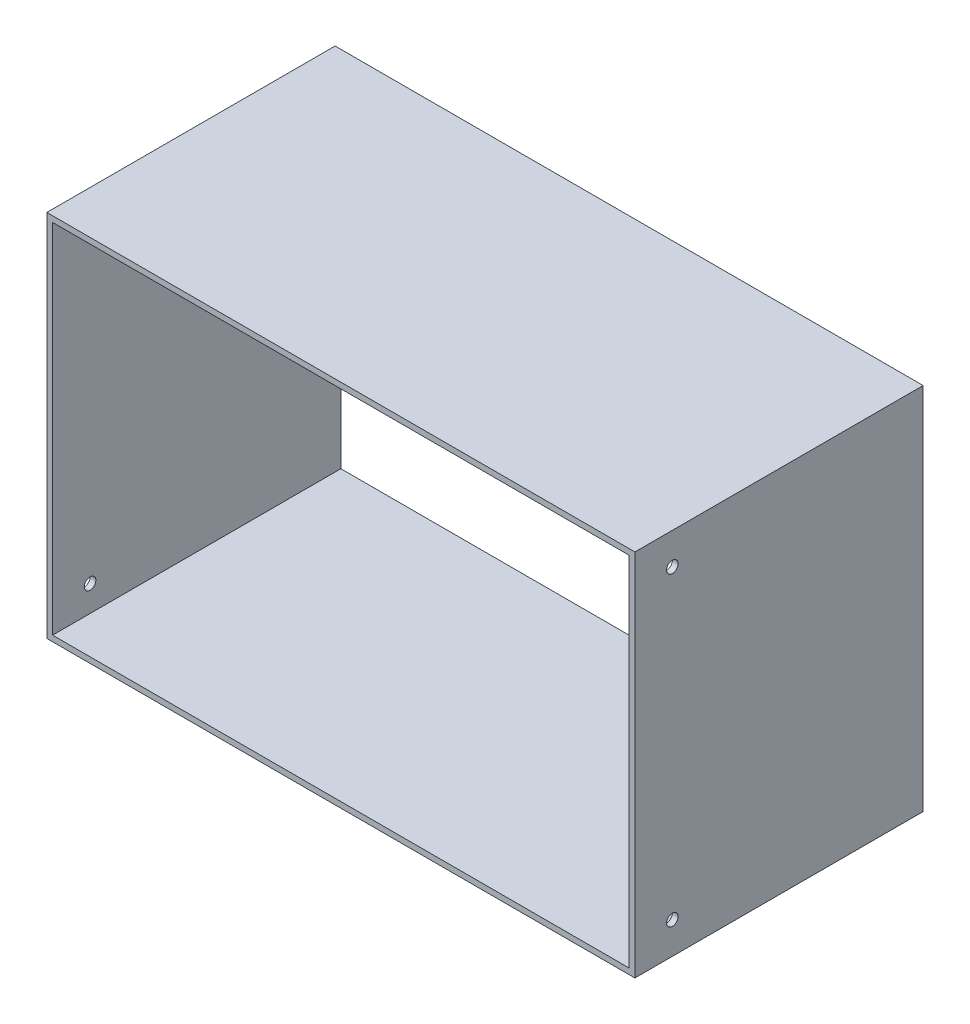
ISO-10303-21;
HEADER;
FILE_DESCRIPTION(('STEP AP214'),'2;1');
FILE_NAME('part.step','',(''),(''),'','','');
FILE_SCHEMA(('AUTOMOTIVE_DESIGN { 1 0 10303 214 1 1 1 1 }'));
ENDSEC;
DATA;
#1=APPLICATION_CONTEXT('core data for automotive mechanical design processes');
#2=APPLICATION_PROTOCOL_DEFINITION('international standard','automotive_design',2000,#1);
#3=PRODUCT_CONTEXT('',#1,'mechanical');
#4=PRODUCT('Part','Part','',(#3));
#5=PRODUCT_RELATED_PRODUCT_CATEGORY('part','',(#4));
#6=PRODUCT_DEFINITION_FORMATION('','',#4);
#7=PRODUCT_DEFINITION_CONTEXT('part definition',#1,'design');
#8=PRODUCT_DEFINITION('design','',#6,#7);
#9=PRODUCT_DEFINITION_SHAPE('','',#8);
#10=(LENGTH_UNIT() NAMED_UNIT(*) SI_UNIT(.MILLI.,.METRE.));
#11=(NAMED_UNIT(*) PLANE_ANGLE_UNIT() SI_UNIT($,.RADIAN.));
#12=(NAMED_UNIT(*) SI_UNIT($,.STERADIAN.) SOLID_ANGLE_UNIT());
#13=UNCERTAINTY_MEASURE_WITH_UNIT(LENGTH_MEASURE(1.E-05),#10,'distance_accuracy_value','');
#14=(GEOMETRIC_REPRESENTATION_CONTEXT(3) GLOBAL_UNCERTAINTY_ASSIGNED_CONTEXT((#13)) GLOBAL_UNIT_ASSIGNED_CONTEXT((#10,
#11,#12)) REPRESENTATION_CONTEXT('',''));
#15=CARTESIAN_POINT('',(0.,0.,0.));
#16=DIRECTION('',(0.,0.,1.));
#17=DIRECTION('',(1.,0.,0.));
#18=AXIS2_PLACEMENT_3D('',#15,#16,#17);
#19=CARTESIAN_POINT('',(0.,2.99999999999996,50.));
#20=DIRECTION('',(0.,-1.,0.));
#21=DIRECTION('',(1.,0.,0.));
#22=AXIS2_PLACEMENT_3D('',#19,#20,#21);
#23=PLANE('',#22);
#24=DIRECTION('',(-1.,0.,0.));
#25=VECTOR('',#24,1.);
#26=CARTESIAN_POINT('',(0.,2.99999999999996,0.));
#27=LINE('',#26,#25);
#28=CARTESIAN_POINT('',(103.,2.99999999999998,0.));
#29=VERTEX_POINT('',#28);
#30=CARTESIAN_POINT('',(3.,2.99999999999996,0.));
#31=VERTEX_POINT('',#30);
#32=EDGE_CURVE('E143',#29,#31,#27,.T.);
#33=ORIENTED_EDGE('',*,*,#32,.T.);
#34=DIRECTION('',(0.,0.,-1.));
#35=VECTOR('',#34,1.);
#36=CARTESIAN_POINT('',(3.,2.99999999999996,50.));
#37=LINE('',#36,#35);
#38=CARTESIAN_POINT('',(3.,2.99999999999996,50.));
#39=VERTEX_POINT('',#38);
#40=EDGE_CURVE('E11',#39,#31,#37,.T.);
#41=ORIENTED_EDGE('',*,*,#40,.F.);
#42=DIRECTION('',(-1.,0.,0.));
#43=VECTOR('',#42,1.);
#44=CARTESIAN_POINT('',(0.,2.99999999999996,50.));
#45=LINE('',#44,#43);
#46=CARTESIAN_POINT('',(103.,2.99999999999998,50.));
#47=VERTEX_POINT('',#46);
#48=EDGE_CURVE('E119',#47,#39,#45,.T.);
#49=ORIENTED_EDGE('',*,*,#48,.F.);
#50=DIRECTION('',(0.,0.,-1.));
#51=VECTOR('',#50,1.);
#52=CARTESIAN_POINT('',(103.,2.99999999999998,50.));
#53=LINE('',#52,#51);
#54=EDGE_CURVE('E150',#47,#29,#53,.T.);
#55=ORIENTED_EDGE('',*,*,#54,.T.);
#56=EDGE_LOOP('',(#33,#41,#49,#55));
#57=FACE_BOUND('',#56,.T.);
#58=ADVANCED_FACE('F37',(#57),#23,.F.);
#59=CARTESIAN_POINT('',(3.,0.,50.));
#60=DIRECTION('',(-1.,0.,0.));
#61=DIRECTION('',(0.,-1.,0.));
#62=AXIS2_PLACEMENT_3D('',#59,#60,#61);
#63=PLANE('',#62);
#64=CARTESIAN_POINT('',(3.,7.49999999999998,43.5));
#65=DIRECTION('',(-1.,0.,0.));
#66=DIRECTION('',(0.,-1.,0.));
#67=AXIS2_PLACEMENT_3D('',#64,#65,#66);
#68=CIRCLE('',#67,0.999999999999998);
#69=CARTESIAN_POINT('',(3.,6.49999999999998,43.5));
#70=VERTEX_POINT('',#69);
#71=EDGE_CURVE('E137',#70,#70,#68,.T.);
#72=ORIENTED_EDGE('',*,*,#71,.T.);
#73=EDGE_LOOP('',(#72));
#74=FACE_BOUND('',#73,.T.);
#75=CARTESIAN_POINT('',(3.,60.5,43.5));
#76=DIRECTION('',(-1.,0.,0.));
#77=DIRECTION('',(0.,-1.,0.));
#78=AXIS2_PLACEMENT_3D('',#75,#76,#77);
#79=CIRCLE('',#78,0.999999999999998);
#80=CARTESIAN_POINT('',(3.,59.5,43.5));
#81=VERTEX_POINT('',#80);
#82=EDGE_CURVE('E169',#81,#81,#79,.T.);
#83=ORIENTED_EDGE('',*,*,#82,.T.);
#84=EDGE_LOOP('',(#83));
#85=FACE_BOUND('',#84,.T.);
#86=DIRECTION('',(0.,1.,0.));
#87=VECTOR('',#86,1.);
#88=CARTESIAN_POINT('',(3.,0.,0.));
#89=LINE('',#88,#87);
#90=CARTESIAN_POINT('',(3.,64.9999999999999,0.));
#91=VERTEX_POINT('',#90);
#92=EDGE_CURVE('E124',#31,#91,#89,.T.);
#93=ORIENTED_EDGE('',*,*,#92,.T.);
#94=DIRECTION('',(0.,0.,-1.));
#95=VECTOR('',#94,1.);
#96=CARTESIAN_POINT('',(3.,64.9999999999999,50.));
#97=LINE('',#96,#95);
#98=CARTESIAN_POINT('',(3.,64.9999999999999,50.));
#99=VERTEX_POINT('',#98);
#100=EDGE_CURVE('E47',#99,#91,#97,.T.);
#101=ORIENTED_EDGE('',*,*,#100,.F.);
#102=DIRECTION('',(0.,1.,0.));
#103=VECTOR('',#102,1.);
#104=CARTESIAN_POINT('',(3.,0.,50.));
#105=LINE('',#104,#103);
#106=EDGE_CURVE('E113',#39,#99,#105,.T.);
#107=ORIENTED_EDGE('',*,*,#106,.F.);
#108=ORIENTED_EDGE('',*,*,#40,.T.);
#109=EDGE_LOOP('',(#93,#101,#107,#108));
#110=FACE_BOUND('',#109,.T.);
#111=ADVANCED_FACE('F123',(#74,#85,#110),#63,.F.);
#112=CARTESIAN_POINT('',(0.,64.9999999999999,50.));
#113=DIRECTION('',(0.,1.,0.));
#114=DIRECTION('',(0.,0.,1.));
#115=AXIS2_PLACEMENT_3D('',#112,#113,#114);
#116=PLANE('',#115);
#117=DIRECTION('',(1.,0.,0.));
#118=VECTOR('',#117,1.);
#119=CARTESIAN_POINT('',(0.,64.9999999999999,0.));
#120=LINE('',#119,#118);
#121=CARTESIAN_POINT('',(103.,64.9999999999999,0.));
#122=VERTEX_POINT('',#121);
#123=EDGE_CURVE('E85',#91,#122,#120,.T.);
#124=ORIENTED_EDGE('',*,*,#123,.T.);
#125=DIRECTION('',(0.,0.,-1.));
#126=VECTOR('',#125,1.);
#127=CARTESIAN_POINT('',(103.,64.9999999999999,50.));
#128=LINE('',#127,#126);
#129=CARTESIAN_POINT('',(103.,64.9999999999999,50.));
#130=VERTEX_POINT('',#129);
#131=EDGE_CURVE('E125',#130,#122,#128,.T.);
#132=ORIENTED_EDGE('',*,*,#131,.F.);
#133=DIRECTION('',(1.,0.,0.));
#134=VECTOR('',#133,1.);
#135=CARTESIAN_POINT('',(0.,64.9999999999999,50.));
#136=LINE('',#135,#134);
#137=EDGE_CURVE('E117',#99,#130,#136,.T.);
#138=ORIENTED_EDGE('',*,*,#137,.F.);
#139=ORIENTED_EDGE('',*,*,#100,.T.);
#140=EDGE_LOOP('',(#124,#132,#138,#139));
#141=FACE_BOUND('',#140,.T.);
#142=ADVANCED_FACE('F127',(#141),#116,.F.);
#143=CARTESIAN_POINT('',(104.,0.,50.));
#144=DIRECTION('',(-1.,0.,0.));
#145=DIRECTION('',(0.,0.,1.));
#146=AXIS2_PLACEMENT_3D('',#143,#144,#145);
#147=PLANE('',#146);
#148=CARTESIAN_POINT('',(104.,7.49999999999998,43.5));
#149=DIRECTION('',(-1.,0.,0.));
#150=DIRECTION('',(0.,0.,1.));
#151=AXIS2_PLACEMENT_3D('',#148,#149,#150);
#152=CIRCLE('',#151,0.999999999999998);
#153=CARTESIAN_POINT('',(104.,7.49999999999998,44.5));
#154=VERTEX_POINT('',#153);
#155=EDGE_CURVE('E165',#154,#154,#152,.T.);
#156=ORIENTED_EDGE('',*,*,#155,.T.);
#157=EDGE_LOOP('',(#156));
#158=FACE_BOUND('',#157,.T.);
#159=CARTESIAN_POINT('',(104.,60.5,43.5));
#160=DIRECTION('',(-1.,0.,0.));
#161=DIRECTION('',(0.,0.,1.));
#162=AXIS2_PLACEMENT_3D('',#159,#160,#161);
#163=CIRCLE('',#162,0.999999999999998);
#164=CARTESIAN_POINT('',(104.,60.5,44.5));
#165=VERTEX_POINT('',#164);
#166=EDGE_CURVE('E172',#165,#165,#163,.T.);
#167=ORIENTED_EDGE('',*,*,#166,.T.);
#168=EDGE_LOOP('',(#167));
#169=FACE_BOUND('',#168,.T.);
#170=DIRECTION('',(0.,1.,0.));
#171=VECTOR('',#170,1.);
#172=CARTESIAN_POINT('',(104.,0.,0.));
#173=LINE('',#172,#171);
#174=CARTESIAN_POINT('',(104.,2.,0.));
#175=VERTEX_POINT('',#174);
#176=CARTESIAN_POINT('',(104.,66.,0.));
#177=VERTEX_POINT('',#176);
#178=EDGE_CURVE('E133',#175,#177,#173,.T.);
#179=ORIENTED_EDGE('',*,*,#178,.T.);
#180=DIRECTION('',(0.,0.,-1.));
#181=VECTOR('',#180,1.);
#182=CARTESIAN_POINT('',(104.,66.,50.));
#183=LINE('',#182,#181);
#184=CARTESIAN_POINT('',(104.,66.,50.));
#185=VERTEX_POINT('',#184);
#186=EDGE_CURVE('E152',#185,#177,#183,.T.);
#187=ORIENTED_EDGE('',*,*,#186,.F.);
#188=DIRECTION('',(0.,1.,0.));
#189=VECTOR('',#188,1.);
#190=CARTESIAN_POINT('',(104.,0.,50.));
#191=LINE('',#190,#189);
#192=CARTESIAN_POINT('',(104.,2.,50.));
#193=VERTEX_POINT('',#192);
#194=EDGE_CURVE('E149',#193,#185,#191,.T.);
#195=ORIENTED_EDGE('',*,*,#194,.F.);
#196=DIRECTION('',(0.,0.,-1.));
#197=VECTOR('',#196,1.);
#198=CARTESIAN_POINT('',(104.,2.,50.));
#199=LINE('',#198,#197);
#200=EDGE_CURVE('E129',#193,#175,#199,.T.);
#201=ORIENTED_EDGE('',*,*,#200,.T.);
#202=EDGE_LOOP('',(#179,#187,#195,#201));
#203=FACE_BOUND('',#202,.T.);
#204=ADVANCED_FACE('F39',(#158,#169,#203),#147,.F.);
#205=CARTESIAN_POINT('',(0.,66.,50.));
#206=DIRECTION('',(0.,-1.,0.));
#207=DIRECTION('',(1.,0.,0.));
#208=AXIS2_PLACEMENT_3D('',#205,#206,#207);
#209=PLANE('',#208);
#210=DIRECTION('',(-1.,0.,0.));
#211=VECTOR('',#210,1.);
#212=CARTESIAN_POINT('',(0.,66.,0.));
#213=LINE('',#212,#211);
#214=CARTESIAN_POINT('',(1.99999999999999,66.,0.));
#215=VERTEX_POINT('',#214);
#216=EDGE_CURVE('E136',#177,#215,#213,.T.);
#217=ORIENTED_EDGE('',*,*,#216,.T.);
#218=DIRECTION('',(0.,0.,-1.));
#219=VECTOR('',#218,1.);
#220=CARTESIAN_POINT('',(1.99999999999999,66.,50.));
#221=LINE('',#220,#219);
#222=CARTESIAN_POINT('',(1.99999999999999,66.,50.));
#223=VERTEX_POINT('',#222);
#224=EDGE_CURVE('E159',#223,#215,#221,.T.);
#225=ORIENTED_EDGE('',*,*,#224,.F.);
#226=DIRECTION('',(-1.,0.,0.));
#227=VECTOR('',#226,1.);
#228=CARTESIAN_POINT('',(0.,66.,50.));
#229=LINE('',#228,#227);
#230=EDGE_CURVE('E100',#185,#223,#229,.T.);
#231=ORIENTED_EDGE('',*,*,#230,.F.);
#232=ORIENTED_EDGE('',*,*,#186,.T.);
#233=EDGE_LOOP('',(#217,#225,#231,#232));
#234=FACE_BOUND('',#233,.T.);
#235=ADVANCED_FACE('F203',(#234),#209,.F.);
#236=CARTESIAN_POINT('',(2.,0.,50.));
#237=DIRECTION('',(1.,0.,0.));
#238=DIRECTION('',(0.,1.,0.));
#239=AXIS2_PLACEMENT_3D('',#236,#237,#238);
#240=PLANE('',#239);
#241=CARTESIAN_POINT('',(2.,7.49999999999998,43.5));
#242=DIRECTION('',(1.,0.,0.));
#243=DIRECTION('',(0.,1.,0.));
#244=AXIS2_PLACEMENT_3D('',#241,#242,#243);
#245=CIRCLE('',#244,0.999999999999998);
#246=CARTESIAN_POINT('',(2.,8.49999999999998,43.5));
#247=VERTEX_POINT('',#246);
#248=EDGE_CURVE('E181',#247,#247,#245,.T.);
#249=ORIENTED_EDGE('',*,*,#248,.T.);
#250=EDGE_LOOP('',(#249));
#251=FACE_BOUND('',#250,.T.);
#252=CARTESIAN_POINT('',(1.99999999999999,60.5,43.5));
#253=DIRECTION('',(1.,0.,0.));
#254=DIRECTION('',(0.,1.,0.));
#255=AXIS2_PLACEMENT_3D('',#252,#253,#254);
#256=CIRCLE('',#255,0.999999999999998);
#257=CARTESIAN_POINT('',(1.99999999999999,61.5,43.5));
#258=VERTEX_POINT('',#257);
#259=EDGE_CURVE('E164',#258,#258,#256,.T.);
#260=ORIENTED_EDGE('',*,*,#259,.T.);
#261=EDGE_LOOP('',(#260));
#262=FACE_BOUND('',#261,.T.);
#263=DIRECTION('',(0.,-1.,0.));
#264=VECTOR('',#263,1.);
#265=CARTESIAN_POINT('',(2.,0.,0.));
#266=LINE('',#265,#264);
#267=CARTESIAN_POINT('',(2.,2.,0.));
#268=VERTEX_POINT('',#267);
#269=EDGE_CURVE('E139',#215,#268,#266,.T.);
#270=ORIENTED_EDGE('',*,*,#269,.T.);
#271=DIRECTION('',(0.,0.,-1.));
#272=VECTOR('',#271,1.);
#273=CARTESIAN_POINT('',(2.,2.,50.));
#274=LINE('',#273,#272);
#275=CARTESIAN_POINT('',(2.,2.,50.));
#276=VERTEX_POINT('',#275);
#277=EDGE_CURVE('E156',#276,#268,#274,.T.);
#278=ORIENTED_EDGE('',*,*,#277,.F.);
#279=DIRECTION('',(0.,-1.,0.));
#280=VECTOR('',#279,1.);
#281=CARTESIAN_POINT('',(2.,0.,50.));
#282=LINE('',#281,#280);
#283=EDGE_CURVE('E188',#223,#276,#282,.T.);
#284=ORIENTED_EDGE('',*,*,#283,.F.);
#285=ORIENTED_EDGE('',*,*,#224,.T.);
#286=EDGE_LOOP('',(#270,#278,#284,#285));
#287=FACE_BOUND('',#286,.T.);
#288=ADVANCED_FACE('F207',(#251,#262,#287),#240,.F.);
#289=CARTESIAN_POINT('',(0.,2.,50.));
#290=DIRECTION('',(0.,1.,0.));
#291=DIRECTION('',(0.,0.,1.));
#292=AXIS2_PLACEMENT_3D('',#289,#290,#291);
#293=PLANE('',#292);
#294=DIRECTION('',(1.,0.,0.));
#295=VECTOR('',#294,1.);
#296=CARTESIAN_POINT('',(0.,2.,0.));
#297=LINE('',#296,#295);
#298=EDGE_CURVE('E141',#268,#175,#297,.T.);
#299=ORIENTED_EDGE('',*,*,#298,.T.);
#300=ORIENTED_EDGE('',*,*,#200,.F.);
#301=DIRECTION('',(1.,0.,0.));
#302=VECTOR('',#301,1.);
#303=CARTESIAN_POINT('',(0.,2.,50.));
#304=LINE('',#303,#302);
#305=EDGE_CURVE('E190',#276,#193,#304,.T.);
#306=ORIENTED_EDGE('',*,*,#305,.F.);
#307=ORIENTED_EDGE('',*,*,#277,.T.);
#308=EDGE_LOOP('',(#299,#300,#306,#307));
#309=FACE_BOUND('',#308,.T.);
#310=ADVANCED_FACE('F199',(#309),#293,.F.);
#311=CARTESIAN_POINT('',(103.,0.,50.));
#312=DIRECTION('',(1.,0.,0.));
#313=DIRECTION('',(0.,0.,-1.));
#314=AXIS2_PLACEMENT_3D('',#311,#312,#313);
#315=PLANE('',#314);
#316=CARTESIAN_POINT('',(103.,7.49999999999998,43.5));
#317=DIRECTION('',(1.,0.,0.));
#318=DIRECTION('',(0.,0.,-1.));
#319=AXIS2_PLACEMENT_3D('',#316,#317,#318);
#320=CIRCLE('',#319,0.999999999999998);
#321=CARTESIAN_POINT('',(103.,7.49999999999998,42.5));
#322=VERTEX_POINT('',#321);
#323=EDGE_CURVE('E41',#322,#322,#320,.T.);
#324=ORIENTED_EDGE('',*,*,#323,.T.);
#325=EDGE_LOOP('',(#324));
#326=FACE_BOUND('',#325,.T.);
#327=CARTESIAN_POINT('',(103.,60.5,43.5));
#328=DIRECTION('',(1.,0.,0.));
#329=DIRECTION('',(0.,0.,-1.));
#330=AXIS2_PLACEMENT_3D('',#327,#328,#329);
#331=CIRCLE('',#330,0.999999999999998);
#332=CARTESIAN_POINT('',(103.,60.5,42.5));
#333=VERTEX_POINT('',#332);
#334=EDGE_CURVE('E162',#333,#333,#331,.T.);
#335=ORIENTED_EDGE('',*,*,#334,.T.);
#336=EDGE_LOOP('',(#335));
#337=FACE_BOUND('',#336,.T.);
#338=DIRECTION('',(0.,-1.,0.));
#339=VECTOR('',#338,1.);
#340=CARTESIAN_POINT('',(103.,0.,0.));
#341=LINE('',#340,#339);
#342=EDGE_CURVE('E91',#122,#29,#341,.T.);
#343=ORIENTED_EDGE('',*,*,#342,.T.);
#344=ORIENTED_EDGE('',*,*,#54,.F.);
#345=DIRECTION('',(0.,-1.,0.));
#346=VECTOR('',#345,1.);
#347=CARTESIAN_POINT('',(103.,0.,50.));
#348=LINE('',#347,#346);
#349=EDGE_CURVE('E56',#130,#47,#348,.T.);
#350=ORIENTED_EDGE('',*,*,#349,.F.);
#351=ORIENTED_EDGE('',*,*,#131,.T.);
#352=EDGE_LOOP('',(#343,#344,#350,#351));
#353=FACE_BOUND('',#352,.T.);
#354=ADVANCED_FACE('F215',(#326,#337,#353),#315,.F.);
#355=CARTESIAN_POINT('',(0.,0.,50.));
#356=DIRECTION('',(0.,0.,1.));
#357=DIRECTION('',(1.,0.,0.));
#358=AXIS2_PLACEMENT_3D('',#355,#356,#357);
#359=PLANE('',#358);
#360=ORIENTED_EDGE('',*,*,#194,.T.);
#361=ORIENTED_EDGE('',*,*,#230,.T.);
#362=ORIENTED_EDGE('',*,*,#283,.T.);
#363=ORIENTED_EDGE('',*,*,#305,.T.);
#364=EDGE_LOOP('',(#360,#361,#362,#363));
#365=FACE_BOUND('',#364,.T.);
#366=ORIENTED_EDGE('',*,*,#48,.T.);
#367=ORIENTED_EDGE('',*,*,#106,.T.);
#368=ORIENTED_EDGE('',*,*,#137,.T.);
#369=ORIENTED_EDGE('',*,*,#349,.T.);
#370=EDGE_LOOP('',(#366,#367,#368,#369));
#371=FACE_BOUND('',#370,.T.);
#372=ADVANCED_FACE('F115',(#365,#371),#359,.T.);
#373=CARTESIAN_POINT('',(0.,0.,0.));
#374=DIRECTION('',(0.,0.,1.));
#375=DIRECTION('',(1.,0.,0.));
#376=AXIS2_PLACEMENT_3D('',#373,#374,#375);
#377=PLANE('',#376);
#378=ORIENTED_EDGE('',*,*,#178,.F.);
#379=ORIENTED_EDGE('',*,*,#298,.F.);
#380=ORIENTED_EDGE('',*,*,#269,.F.);
#381=ORIENTED_EDGE('',*,*,#216,.F.);
#382=EDGE_LOOP('',(#378,#379,#380,#381));
#383=FACE_BOUND('',#382,.T.);
#384=ORIENTED_EDGE('',*,*,#32,.F.);
#385=ORIENTED_EDGE('',*,*,#342,.F.);
#386=ORIENTED_EDGE('',*,*,#123,.F.);
#387=ORIENTED_EDGE('',*,*,#92,.F.);
#388=EDGE_LOOP('',(#384,#385,#386,#387));
#389=FACE_BOUND('',#388,.T.);
#390=ADVANCED_FACE('F208',(#383,#389),#377,.F.);
#391=CARTESIAN_POINT('',(104.,60.5,43.5));
#392=DIRECTION('',(-1.,0.,0.));
#393=DIRECTION('',(0.,0.,1.));
#394=AXIS2_PLACEMENT_3D('',#391,#392,#393);
#395=CYLINDRICAL_SURFACE('',#394,0.999999999999998);
#396=ORIENTED_EDGE('',*,*,#166,.F.);
#397=EDGE_LOOP('',(#396));
#398=FACE_BOUND('',#397,.T.);
#399=ORIENTED_EDGE('',*,*,#334,.F.);
#400=EDGE_LOOP('',(#399));
#401=FACE_BOUND('',#400,.T.);
#402=ADVANCED_FACE('F211',(#398,#401),#395,.F.);
#403=CARTESIAN_POINT('',(104.,7.49999999999998,43.5));
#404=DIRECTION('',(-1.,0.,0.));
#405=DIRECTION('',(0.,0.,1.));
#406=AXIS2_PLACEMENT_3D('',#403,#404,#405);
#407=CYLINDRICAL_SURFACE('',#406,0.999999999999998);
#408=ORIENTED_EDGE('',*,*,#155,.F.);
#409=EDGE_LOOP('',(#408));
#410=FACE_BOUND('',#409,.T.);
#411=ORIENTED_EDGE('',*,*,#323,.F.);
#412=EDGE_LOOP('',(#411));
#413=FACE_BOUND('',#412,.T.);
#414=ADVANCED_FACE('F249',(#410,#413),#407,.F.);
#415=ORIENTED_EDGE('',*,*,#259,.F.);
#416=EDGE_LOOP('',(#415));
#417=FACE_BOUND('',#416,.T.);
#418=ORIENTED_EDGE('',*,*,#82,.F.);
#419=EDGE_LOOP('',(#418));
#420=FACE_BOUND('',#419,.T.);
#421=ADVANCED_FACE('F251',(#417,#420),#395,.F.);
#422=ORIENTED_EDGE('',*,*,#248,.F.);
#423=EDGE_LOOP('',(#422));
#424=FACE_BOUND('',#423,.T.);
#425=ORIENTED_EDGE('',*,*,#71,.F.);
#426=EDGE_LOOP('',(#425));
#427=FACE_BOUND('',#426,.T.);
#428=ADVANCED_FACE('F257',(#424,#427),#407,.F.);
#429=CLOSED_SHELL('',(#58,#111,#142,#204,#235,#288,#310,#354,#372,#390,#402,#414,#421,#428));
#430=MANIFOLD_SOLID_BREP('B2',#429);
#431=ADVANCED_BREP_SHAPE_REPRESENTATION('',(#18,#430),#14);
#432=SHAPE_DEFINITION_REPRESENTATION(#9,#431);
ENDSEC;
END-ISO-10303-21;
